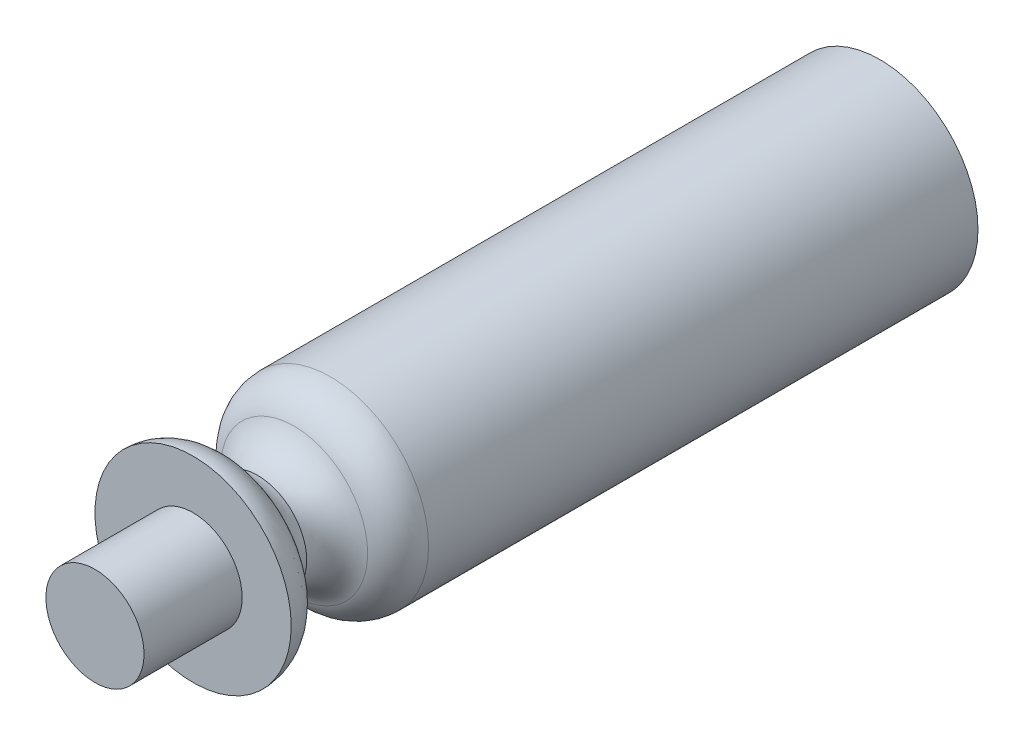
ISO-10303-21;
HEADER;
FILE_DESCRIPTION(('STEP AP214'),'2;1');
FILE_NAME('part.step','',(''),(''),'','','');
FILE_SCHEMA(('AUTOMOTIVE_DESIGN { 1 0 10303 214 1 1 1 1 }'));
ENDSEC;
DATA;
#1=APPLICATION_CONTEXT('core data for automotive mechanical design processes');
#2=APPLICATION_PROTOCOL_DEFINITION('international standard','automotive_design',2000,#1);
#3=PRODUCT_CONTEXT('',#1,'mechanical');
#4=PRODUCT('Part','Part','',(#3));
#5=PRODUCT_RELATED_PRODUCT_CATEGORY('part','',(#4));
#6=PRODUCT_DEFINITION_FORMATION('','',#4);
#7=PRODUCT_DEFINITION_CONTEXT('part definition',#1,'design');
#8=PRODUCT_DEFINITION('design','',#6,#7);
#9=PRODUCT_DEFINITION_SHAPE('','',#8);
#10=(LENGTH_UNIT() NAMED_UNIT(*) SI_UNIT(.MILLI.,.METRE.));
#11=(NAMED_UNIT(*) PLANE_ANGLE_UNIT() SI_UNIT($,.RADIAN.));
#12=(NAMED_UNIT(*) SI_UNIT($,.STERADIAN.) SOLID_ANGLE_UNIT());
#13=UNCERTAINTY_MEASURE_WITH_UNIT(LENGTH_MEASURE(1.E-05),#10,'distance_accuracy_value','');
#14=(GEOMETRIC_REPRESENTATION_CONTEXT(3) GLOBAL_UNCERTAINTY_ASSIGNED_CONTEXT((#13)) GLOBAL_UNIT_ASSIGNED_CONTEXT((#10,
#11,#12)) REPRESENTATION_CONTEXT('',''));
#15=CARTESIAN_POINT('',(0.,0.,0.));
#16=DIRECTION('',(0.,0.,1.));
#17=DIRECTION('',(1.,0.,0.));
#18=AXIS2_PLACEMENT_3D('',#15,#16,#17);
#19=CARTESIAN_POINT('',(0.,0.,40.));
#20=DIRECTION('',(0.,0.,-1.));
#21=DIRECTION('',(-1.,0.,0.));
#22=AXIS2_PLACEMENT_3D('',#19,#20,#21);
#23=CYLINDRICAL_SURFACE('',#22,5.);
#24=CARTESIAN_POINT('',(0.,0.,28.));
#25=DIRECTION('',(0.,0.,1.));
#26=DIRECTION('',(1.,0.,0.));
#27=AXIS2_PLACEMENT_3D('',#24,#25,#26);
#28=CIRCLE('',#27,5.);
#29=CARTESIAN_POINT('',(5.,0.,28.));
#30=VERTEX_POINT('',#29);
#31=EDGE_CURVE('E130',#30,#30,#28,.F.);
#32=ORIENTED_EDGE('',*,*,#31,.T.);
#33=EDGE_LOOP('',(#32));
#34=FACE_BOUND('',#33,.T.);
#35=CARTESIAN_POINT('',(0.,0.,0.));
#36=DIRECTION('',(0.,0.,1.));
#37=DIRECTION('',(1.,0.,0.));
#38=AXIS2_PLACEMENT_3D('',#35,#36,#37);
#39=CIRCLE('',#38,5.);
#40=CARTESIAN_POINT('',(5.,0.,0.));
#41=VERTEX_POINT('',#40);
#42=EDGE_CURVE('E125',#41,#41,#39,.T.);
#43=ORIENTED_EDGE('',*,*,#42,.T.);
#44=EDGE_LOOP('',(#43));
#45=FACE_BOUND('',#44,.T.);
#46=ADVANCED_FACE('F47',(#34,#45),#23,.T.);
#47=CARTESIAN_POINT('',(0.,0.,0.));
#48=DIRECTION('',(0.,0.,1.));
#49=DIRECTION('',(1.,0.,0.));
#50=AXIS2_PLACEMENT_3D('',#47,#48,#49);
#51=PLANE('',#50);
#52=DIRECTION('',(0.,1.,0.));
#53=VECTOR('',#52,1.);
#54=CARTESIAN_POINT('',(-2.2,2.32379000772445,0.));
#55=LINE('',#54,#53);
#56=CARTESIAN_POINT('',(-2.2,-2.32379000772445,0.));
#57=VERTEX_POINT('',#56);
#58=CARTESIAN_POINT('',(-2.2,2.32379000772445,0.));
#59=VERTEX_POINT('',#58);
#60=EDGE_CURVE('E97',#57,#59,#55,.T.);
#61=ORIENTED_EDGE('',*,*,#60,.F.);
#62=CARTESIAN_POINT('',(0.,0.,0.));
#63=DIRECTION('',(0.,0.,-1.));
#64=DIRECTION('',(-1.,0.,0.));
#65=AXIS2_PLACEMENT_3D('',#62,#63,#64);
#66=CIRCLE('',#65,3.2);
#67=CARTESIAN_POINT('',(2.2,-2.32379000772445,0.));
#68=VERTEX_POINT('',#67);
#69=EDGE_CURVE('E62',#68,#57,#66,.T.);
#70=ORIENTED_EDGE('',*,*,#69,.F.);
#71=DIRECTION('',(0.,-1.,0.));
#72=VECTOR('',#71,1.);
#73=CARTESIAN_POINT('',(2.2,-2.32379000772445,0.));
#74=LINE('',#73,#72);
#75=CARTESIAN_POINT('',(2.2,2.32379000772445,0.));
#76=VERTEX_POINT('',#75);
#77=EDGE_CURVE('E113',#76,#68,#74,.T.);
#78=ORIENTED_EDGE('',*,*,#77,.F.);
#79=CARTESIAN_POINT('',(0.,0.,0.));
#80=DIRECTION('',(0.,0.,-1.));
#81=DIRECTION('',(-1.,0.,0.));
#82=AXIS2_PLACEMENT_3D('',#79,#80,#81);
#83=CIRCLE('',#82,3.2);
#84=EDGE_CURVE('E121',#59,#76,#83,.T.);
#85=ORIENTED_EDGE('',*,*,#84,.F.);
#86=EDGE_LOOP('',(#61,#70,#78,#85));
#87=FACE_BOUND('',#86,.T.);
#88=ORIENTED_EDGE('',*,*,#42,.F.);
#89=EDGE_LOOP('',(#88));
#90=FACE_BOUND('',#89,.T.);
#91=ADVANCED_FACE('F156',(#87,#90),#51,.F.);
#92=CARTESIAN_POINT('',(0.,0.,7.));
#93=DIRECTION('',(0.,0.,-1.));
#94=DIRECTION('',(-1.,0.,0.));
#95=AXIS2_PLACEMENT_3D('',#92,#93,#94);
#96=CYLINDRICAL_SURFACE('',#95,3.2);
#97=ORIENTED_EDGE('',*,*,#69,.T.);
#98=DIRECTION('',(0.,0.,-1.));
#99=VECTOR('',#98,1.);
#100=CARTESIAN_POINT('',(-2.2,-2.32379000772445,7.));
#101=LINE('',#100,#99);
#102=CARTESIAN_POINT('',(-2.2,-2.32379000772445,7.));
#103=VERTEX_POINT('',#102);
#104=EDGE_CURVE('E85',#103,#57,#101,.T.);
#105=ORIENTED_EDGE('',*,*,#104,.F.);
#106=CARTESIAN_POINT('',(0.,0.,7.));
#107=DIRECTION('',(0.,0.,-1.));
#108=DIRECTION('',(-1.,0.,0.));
#109=AXIS2_PLACEMENT_3D('',#106,#107,#108);
#110=CIRCLE('',#109,3.2);
#111=CARTESIAN_POINT('',(2.2,-2.32379000772445,7.));
#112=VERTEX_POINT('',#111);
#113=EDGE_CURVE('E111',#112,#103,#110,.T.);
#114=ORIENTED_EDGE('',*,*,#113,.F.);
#115=DIRECTION('',(0.,0.,-1.));
#116=VECTOR('',#115,1.);
#117=CARTESIAN_POINT('',(2.2,-2.32379000772445,7.));
#118=LINE('',#117,#116);
#119=EDGE_CURVE('E70',#112,#68,#118,.T.);
#120=ORIENTED_EDGE('',*,*,#119,.T.);
#121=EDGE_LOOP('',(#97,#105,#114,#120));
#122=FACE_BOUND('',#121,.T.);
#123=ADVANCED_FACE('F162',(#122),#96,.F.);
#124=CARTESIAN_POINT('',(2.2,-2.32379000772445,7.));
#125=DIRECTION('',(1.,0.,0.));
#126=DIRECTION('',(0.,0.,-1.));
#127=AXIS2_PLACEMENT_3D('',#124,#125,#126);
#128=PLANE('',#127);
#129=ORIENTED_EDGE('',*,*,#77,.T.);
#130=ORIENTED_EDGE('',*,*,#119,.F.);
#131=DIRECTION('',(0.,-1.,0.));
#132=VECTOR('',#131,1.);
#133=CARTESIAN_POINT('',(2.2,-2.32379000772445,7.));
#134=LINE('',#133,#132);
#135=CARTESIAN_POINT('',(2.2,2.32379000772445,7.));
#136=VERTEX_POINT('',#135);
#137=EDGE_CURVE('E108',#136,#112,#134,.T.);
#138=ORIENTED_EDGE('',*,*,#137,.F.);
#139=DIRECTION('',(0.,0.,-1.));
#140=VECTOR('',#139,1.);
#141=CARTESIAN_POINT('',(2.2,2.32379000772445,7.));
#142=LINE('',#141,#140);
#143=EDGE_CURVE('E101',#136,#76,#142,.T.);
#144=ORIENTED_EDGE('',*,*,#143,.T.);
#145=EDGE_LOOP('',(#129,#130,#138,#144));
#146=FACE_BOUND('',#145,.T.);
#147=ADVANCED_FACE('F200',(#146),#128,.F.);
#148=CARTESIAN_POINT('',(0.,0.,7.));
#149=DIRECTION('',(0.,0.,-1.));
#150=DIRECTION('',(-1.,0.,0.));
#151=AXIS2_PLACEMENT_3D('',#148,#149,#150);
#152=CYLINDRICAL_SURFACE('',#151,3.2);
#153=ORIENTED_EDGE('',*,*,#84,.T.);
#154=ORIENTED_EDGE('',*,*,#143,.F.);
#155=CARTESIAN_POINT('',(0.,0.,7.));
#156=DIRECTION('',(0.,0.,-1.));
#157=DIRECTION('',(-1.,0.,0.));
#158=AXIS2_PLACEMENT_3D('',#155,#156,#157);
#159=CIRCLE('',#158,3.2);
#160=CARTESIAN_POINT('',(-2.2,2.32379000772445,7.));
#161=VERTEX_POINT('',#160);
#162=EDGE_CURVE('E104',#161,#136,#159,.T.);
#163=ORIENTED_EDGE('',*,*,#162,.F.);
#164=DIRECTION('',(0.,0.,-1.));
#165=VECTOR('',#164,1.);
#166=CARTESIAN_POINT('',(-2.2,2.32379000772445,7.));
#167=LINE('',#166,#165);
#168=EDGE_CURVE('E90',#161,#59,#167,.T.);
#169=ORIENTED_EDGE('',*,*,#168,.T.);
#170=EDGE_LOOP('',(#153,#154,#163,#169));
#171=FACE_BOUND('',#170,.T.);
#172=ADVANCED_FACE('F105',(#171),#152,.F.);
#173=CARTESIAN_POINT('',(-2.2,2.32379000772445,7.));
#174=DIRECTION('',(-1.,0.,0.));
#175=DIRECTION('',(0.,0.,1.));
#176=AXIS2_PLACEMENT_3D('',#173,#174,#175);
#177=PLANE('',#176);
#178=ORIENTED_EDGE('',*,*,#60,.T.);
#179=ORIENTED_EDGE('',*,*,#168,.F.);
#180=DIRECTION('',(0.,1.,0.));
#181=VECTOR('',#180,1.);
#182=CARTESIAN_POINT('',(-2.2,2.32379000772445,7.));
#183=LINE('',#182,#181);
#184=EDGE_CURVE('E94',#103,#161,#183,.T.);
#185=ORIENTED_EDGE('',*,*,#184,.F.);
#186=ORIENTED_EDGE('',*,*,#104,.T.);
#187=EDGE_LOOP('',(#178,#179,#185,#186));
#188=FACE_BOUND('',#187,.T.);
#189=ADVANCED_FACE('F92',(#188),#177,.F.);
#190=CARTESIAN_POINT('',(0.,0.,7.));
#191=DIRECTION('',(0.,0.,-1.));
#192=DIRECTION('',(-1.,0.,0.));
#193=AXIS2_PLACEMENT_3D('',#190,#191,#192);
#194=PLANE('',#193);
#195=ORIENTED_EDGE('',*,*,#113,.T.);
#196=ORIENTED_EDGE('',*,*,#184,.T.);
#197=ORIENTED_EDGE('',*,*,#162,.T.);
#198=ORIENTED_EDGE('',*,*,#137,.T.);
#199=EDGE_LOOP('',(#195,#196,#197,#198));
#200=FACE_BOUND('',#199,.T.);
#201=ADVANCED_FACE('F110',(#200),#194,.T.);
#202=CARTESIAN_POINT('',(0.,0.,35.));
#203=DIRECTION('',(0.,0.,1.));
#204=DIRECTION('',(1.,0.,0.));
#205=AXIS2_PLACEMENT_3D('',#202,#203,#204);
#206=PLANE('',#205);
#207=CARTESIAN_POINT('',(0.,0.,35.));
#208=DIRECTION('',(0.,0.,1.));
#209=DIRECTION('',(1.,0.,0.));
#210=AXIS2_PLACEMENT_3D('',#207,#208,#209);
#211=CIRCLE('',#210,5.);
#212=CARTESIAN_POINT('',(5.,0.,35.));
#213=VERTEX_POINT('',#212);
#214=EDGE_CURVE('E119',#213,#213,#211,.F.);
#215=ORIENTED_EDGE('',*,*,#214,.F.);
#216=EDGE_LOOP('',(#215));
#217=FACE_BOUND('',#216,.T.);
#218=CARTESIAN_POINT('',(0.,0.,35.));
#219=DIRECTION('',(0.,0.,1.));
#220=DIRECTION('',(1.,0.,0.));
#221=AXIS2_PLACEMENT_3D('',#218,#219,#220);
#222=CIRCLE('',#221,2.5);
#223=CARTESIAN_POINT('',(2.5,0.,35.));
#224=VERTEX_POINT('',#223);
#225=EDGE_CURVE('E133',#224,#224,#222,.T.);
#226=ORIENTED_EDGE('',*,*,#225,.F.);
#227=EDGE_LOOP('',(#226));
#228=FACE_BOUND('',#227,.T.);
#229=ADVANCED_FACE('F178',(#217,#228),#206,.T.);
#230=CARTESIAN_POINT('',(0.,0.,35.));
#231=DIRECTION('',(0.,0.,1.));
#232=DIRECTION('',(1.,0.,0.));
#233=AXIS2_PLACEMENT_3D('',#230,#231,#232);
#234=CYLINDRICAL_SURFACE('',#233,2.5);
#235=ORIENTED_EDGE('',*,*,#225,.T.);
#236=EDGE_LOOP('',(#235));
#237=FACE_BOUND('',#236,.T.);
#238=CARTESIAN_POINT('',(0.,0.,40.));
#239=DIRECTION('',(0.,0.,1.));
#240=DIRECTION('',(1.,0.,0.));
#241=AXIS2_PLACEMENT_3D('',#238,#239,#240);
#242=CIRCLE('',#241,2.5);
#243=CARTESIAN_POINT('',(2.5,0.,40.));
#244=VERTEX_POINT('',#243);
#245=EDGE_CURVE('E186',#244,#244,#242,.T.);
#246=ORIENTED_EDGE('',*,*,#245,.F.);
#247=EDGE_LOOP('',(#246));
#248=FACE_BOUND('',#247,.T.);
#249=ADVANCED_FACE('F181',(#237,#248),#234,.T.);
#250=CARTESIAN_POINT('',(0.,0.,40.));
#251=DIRECTION('',(0.,0.,1.));
#252=DIRECTION('',(1.,0.,0.));
#253=AXIS2_PLACEMENT_3D('',#250,#251,#252);
#254=PLANE('',#253);
#255=ORIENTED_EDGE('',*,*,#245,.T.);
#256=EDGE_LOOP('',(#255));
#257=FACE_BOUND('',#256,.T.);
#258=ADVANCED_FACE('F170',(#257),#254,.T.);
#259=CARTESIAN_POINT('',(0.,0.,28.));
#260=DIRECTION('',(0.,0.,1.));
#261=DIRECTION('',(1.,0.,0.));
#262=AXIS2_PLACEMENT_3D('',#259,#260,#261);
#263=TOROIDAL_SURFACE('',#262,3.,2.);
#264=CARTESIAN_POINT('',(0.,0.,29.8540496217739));
#265=DIRECTION('',(0.,0.,-1.));
#266=DIRECTION('',(-1.,0.,0.));
#267=AXIS2_PLACEMENT_3D('',#264,#265,#266);
#268=CIRCLE('',#267,3.75);
#269=CARTESIAN_POINT('',(-3.75,0.,29.8540496217739));
#270=VERTEX_POINT('',#269);
#271=EDGE_CURVE('E55',#270,#270,#268,.T.);
#272=ORIENTED_EDGE('',*,*,#271,.T.);
#273=EDGE_LOOP('',(#272));
#274=FACE_BOUND('',#273,.T.);
#275=ORIENTED_EDGE('',*,*,#31,.F.);
#276=EDGE_LOOP('',(#275));
#277=FACE_BOUND('',#276,.T.);
#278=ADVANCED_FACE('F141',(#274,#277),#263,.T.);
#279=CARTESIAN_POINT('',(0.,0.,35.));
#280=DIRECTION('',(0.,0.,1.));
#281=DIRECTION('',(1.,0.,0.));
#282=AXIS2_PLACEMENT_3D('',#279,#280,#281);
#283=TOROIDAL_SURFACE('',#282,3.,2.);
#284=CARTESIAN_POINT('',(0.,0.,33.1364352936947));
#285=DIRECTION('',(0.,0.,1.));
#286=DIRECTION('',(1.,0.,0.));
#287=AXIS2_PLACEMENT_3D('',#284,#285,#286);
#288=CIRCLE('',#287,3.72603483760296);
#289=CARTESIAN_POINT('',(3.72603483760296,0.,33.1364352936947));
#290=VERTEX_POINT('',#289);
#291=EDGE_CURVE('E12',#290,#290,#288,.T.);
#292=ORIENTED_EDGE('',*,*,#291,.T.);
#293=EDGE_LOOP('',(#292));
#294=FACE_BOUND('',#293,.T.);
#295=ORIENTED_EDGE('',*,*,#214,.T.);
#296=EDGE_LOOP('',(#295));
#297=FACE_BOUND('',#296,.T.);
#298=ADVANCED_FACE('F147',(#294,#297),#283,.T.);
#299=CARTESIAN_POINT('',(0.,0.,31.7080992435478));
#300=DIRECTION('',(0.,0.,1.));
#301=DIRECTION('',(1.,0.,0.));
#302=AXIS2_PLACEMENT_3D('',#299,#300,#301);
#303=TOROIDAL_SURFACE('',#302,4.5,2.);
#304=ORIENTED_EDGE('',*,*,#271,.F.);
#305=EDGE_LOOP('',(#304));
#306=FACE_BOUND('',#305,.T.);
#307=CARTESIAN_POINT('',(0.,0.,31.7080992435478));
#308=DIRECTION('',(0.,0.,1.));
#309=DIRECTION('',(1.,0.,0.));
#310=AXIS2_PLACEMENT_3D('',#307,#308,#309);
#311=CIRCLE('',#310,2.5);
#312=CARTESIAN_POINT('',(2.5,0.,31.7080992435478));
#313=VERTEX_POINT('',#312);
#314=EDGE_CURVE('E136',#313,#313,#311,.T.);
#315=ORIENTED_EDGE('',*,*,#314,.F.);
#316=EDGE_LOOP('',(#315));
#317=FACE_BOUND('',#316,.T.);
#318=ADVANCED_FACE('F144',(#306,#317),#303,.F.);
#319=CARTESIAN_POINT('',(0.,0.,31.2728705873894));
#320=DIRECTION('',(0.,0.,1.));
#321=DIRECTION('',(1.,0.,0.));
#322=AXIS2_PLACEMENT_3D('',#319,#320,#321);
#323=TOROIDAL_SURFACE('',#322,4.4520696752059,2.);
#324=ORIENTED_EDGE('',*,*,#291,.F.);
#325=EDGE_LOOP('',(#324));
#326=FACE_BOUND('',#325,.T.);
#327=ORIENTED_EDGE('',*,*,#314,.T.);
#328=EDGE_LOOP('',(#327));
#329=FACE_BOUND('',#328,.T.);
#330=ADVANCED_FACE('F49',(#326,#329),#323,.F.);
#331=CLOSED_SHELL('',(#46,#91,#123,#147,#172,#189,#201,#229,#249,#258,#278,#298,#318,#330));
#332=MANIFOLD_SOLID_BREP('B2',#331);
#333=ADVANCED_BREP_SHAPE_REPRESENTATION('',(#18,#332),#14);
#334=SHAPE_DEFINITION_REPRESENTATION(#9,#333);
ENDSEC;
END-ISO-10303-21;
